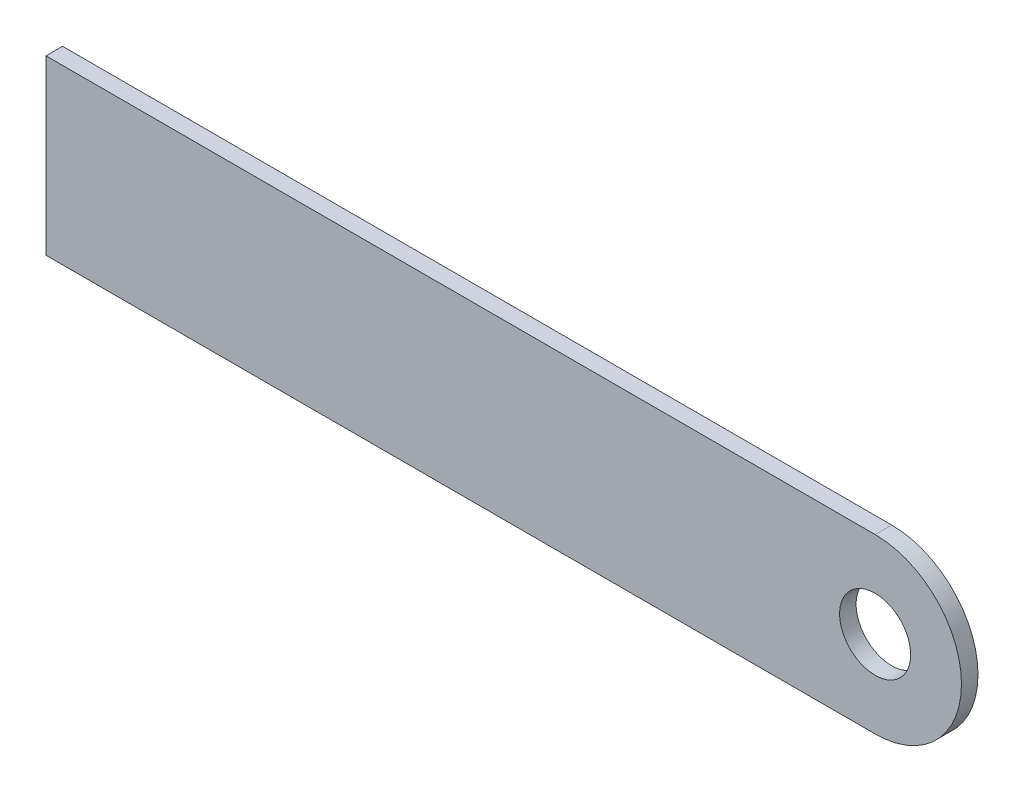
ISO-10303-21;
HEADER;
FILE_DESCRIPTION(('STEP AP214'),'2;1');
FILE_NAME('part.step','',(''),(''),'','','');
FILE_SCHEMA(('AUTOMOTIVE_DESIGN { 1 0 10303 214 1 1 1 1 }'));
ENDSEC;
DATA;
#1=APPLICATION_CONTEXT('core data for automotive mechanical design processes');
#2=APPLICATION_PROTOCOL_DEFINITION('international standard','automotive_design',2000,#1);
#3=PRODUCT_CONTEXT('',#1,'mechanical');
#4=PRODUCT('Part','Part','',(#3));
#5=PRODUCT_RELATED_PRODUCT_CATEGORY('part','',(#4));
#6=PRODUCT_DEFINITION_FORMATION('','',#4);
#7=PRODUCT_DEFINITION_CONTEXT('part definition',#1,'design');
#8=PRODUCT_DEFINITION('design','',#6,#7);
#9=PRODUCT_DEFINITION_SHAPE('','',#8);
#10=(LENGTH_UNIT() NAMED_UNIT(*) SI_UNIT(.MILLI.,.METRE.));
#11=(NAMED_UNIT(*) PLANE_ANGLE_UNIT() SI_UNIT($,.RADIAN.));
#12=(NAMED_UNIT(*) SI_UNIT($,.STERADIAN.) SOLID_ANGLE_UNIT());
#13=UNCERTAINTY_MEASURE_WITH_UNIT(LENGTH_MEASURE(1.E-05),#10,'distance_accuracy_value','');
#14=(GEOMETRIC_REPRESENTATION_CONTEXT(3) GLOBAL_UNCERTAINTY_ASSIGNED_CONTEXT((#13)) GLOBAL_UNIT_ASSIGNED_CONTEXT((#10,
#11,#12)) REPRESENTATION_CONTEXT('',''));
#15=CARTESIAN_POINT('',(0.,0.,0.));
#16=DIRECTION('',(0.,0.,1.));
#17=DIRECTION('',(1.,0.,0.));
#18=AXIS2_PLACEMENT_3D('',#15,#16,#17);
#19=CARTESIAN_POINT('',(0.,0.,-1.51892));
#20=DIRECTION('',(-1.,0.,0.));
#21=DIRECTION('',(0.,0.,1.));
#22=AXIS2_PLACEMENT_3D('',#19,#20,#21);
#23=PLANE('',#22);
#24=DIRECTION('',(0.,-1.,0.));
#25=VECTOR('',#24,1.);
#26=CARTESIAN_POINT('',(0.,0.,0.));
#27=LINE('',#26,#25);
#28=CARTESIAN_POINT('',(0.,15.875,0.));
#29=VERTEX_POINT('',#28);
#30=CARTESIAN_POINT('',(0.,0.,0.));
#31=VERTEX_POINT('',#30);
#32=EDGE_CURVE('E108',#29,#31,#27,.T.);
#33=ORIENTED_EDGE('',*,*,#32,.F.);
#34=DIRECTION('',(0.,0.,1.));
#35=VECTOR('',#34,1.);
#36=CARTESIAN_POINT('',(0.,15.875,-1.51892));
#37=LINE('',#36,#35);
#38=CARTESIAN_POINT('',(0.,15.875,-1.51892));
#39=VERTEX_POINT('',#38);
#40=EDGE_CURVE('E11',#39,#29,#37,.T.);
#41=ORIENTED_EDGE('',*,*,#40,.F.);
#42=DIRECTION('',(0.,-1.,0.));
#43=VECTOR('',#42,1.);
#44=CARTESIAN_POINT('',(0.,0.,-1.51892));
#45=LINE('',#44,#43);
#46=CARTESIAN_POINT('',(0.,0.,-1.51892));
#47=VERTEX_POINT('',#46);
#48=EDGE_CURVE('E101',#39,#47,#45,.T.);
#49=ORIENTED_EDGE('',*,*,#48,.T.);
#50=DIRECTION('',(0.,0.,1.));
#51=VECTOR('',#50,1.);
#52=CARTESIAN_POINT('',(0.,0.,-1.51892));
#53=LINE('',#52,#51);
#54=EDGE_CURVE('E46',#47,#31,#53,.T.);
#55=ORIENTED_EDGE('',*,*,#54,.T.);
#56=EDGE_LOOP('',(#33,#41,#49,#55));
#57=FACE_BOUND('',#56,.T.);
#58=ADVANCED_FACE('F43',(#57),#23,.T.);
#59=CARTESIAN_POINT('',(0.,15.875,-1.51892));
#60=DIRECTION('',(0.,1.,0.));
#61=DIRECTION('',(0.,0.,1.));
#62=AXIS2_PLACEMENT_3D('',#59,#60,#61);
#63=PLANE('',#62);
#64=DIRECTION('',(-1.,0.,0.));
#65=VECTOR('',#64,1.);
#66=CARTESIAN_POINT('',(0.,15.875,0.));
#67=LINE('',#66,#65);
#68=CARTESIAN_POINT('',(76.2,15.875,0.));
#69=VERTEX_POINT('',#68);
#70=EDGE_CURVE('E103',#69,#29,#67,.T.);
#71=ORIENTED_EDGE('',*,*,#70,.F.);
#72=DIRECTION('',(0.,0.,1.));
#73=VECTOR('',#72,1.);
#74=CARTESIAN_POINT('',(76.2,15.875,-1.51892));
#75=LINE('',#74,#73);
#76=CARTESIAN_POINT('',(76.2,15.875,-1.51892));
#77=VERTEX_POINT('',#76);
#78=EDGE_CURVE('E52',#77,#69,#75,.T.);
#79=ORIENTED_EDGE('',*,*,#78,.F.);
#80=DIRECTION('',(-1.,0.,0.));
#81=VECTOR('',#80,1.);
#82=CARTESIAN_POINT('',(0.,15.875,-1.51892));
#83=LINE('',#82,#81);
#84=EDGE_CURVE('E98',#77,#39,#83,.T.);
#85=ORIENTED_EDGE('',*,*,#84,.T.);
#86=ORIENTED_EDGE('',*,*,#40,.T.);
#87=EDGE_LOOP('',(#71,#79,#85,#86));
#88=FACE_BOUND('',#87,.T.);
#89=ADVANCED_FACE('F119',(#88),#63,.T.);
#90=CARTESIAN_POINT('',(76.2,7.9375,-1.51892));
#91=DIRECTION('',(0.,0.,1.));
#92=DIRECTION('',(1.,0.,0.));
#93=AXIS2_PLACEMENT_3D('',#90,#91,#92);
#94=CYLINDRICAL_SURFACE('',#93,7.9375);
#95=CARTESIAN_POINT('',(76.2,7.9375,0.));
#96=DIRECTION('',(0.,0.,1.));
#97=DIRECTION('',(-1.,0.,0.));
#98=AXIS2_PLACEMENT_3D('',#95,#96,#97);
#99=CIRCLE('',#98,7.9375);
#100=CARTESIAN_POINT('',(76.2,0.,0.));
#101=VERTEX_POINT('',#100);
#102=EDGE_CURVE('E93',#101,#69,#99,.T.);
#103=ORIENTED_EDGE('',*,*,#102,.F.);
#104=DIRECTION('',(0.,0.,1.));
#105=VECTOR('',#104,1.);
#106=CARTESIAN_POINT('',(76.2,0.,-1.51892));
#107=LINE('',#106,#105);
#108=CARTESIAN_POINT('',(76.2,0.,-1.51892));
#109=VERTEX_POINT('',#108);
#110=EDGE_CURVE('E88',#109,#101,#107,.T.);
#111=ORIENTED_EDGE('',*,*,#110,.F.);
#112=CARTESIAN_POINT('',(76.2,7.9375,-1.51892));
#113=DIRECTION('',(0.,0.,1.));
#114=DIRECTION('',(-1.,0.,0.));
#115=AXIS2_PLACEMENT_3D('',#112,#113,#114);
#116=CIRCLE('',#115,7.9375);
#117=EDGE_CURVE('E91',#109,#77,#116,.T.);
#118=ORIENTED_EDGE('',*,*,#117,.T.);
#119=ORIENTED_EDGE('',*,*,#78,.T.);
#120=EDGE_LOOP('',(#103,#111,#118,#119));
#121=FACE_BOUND('',#120,.T.);
#122=ADVANCED_FACE('F90',(#121),#94,.T.);
#123=CARTESIAN_POINT('',(0.,0.,-1.51892));
#124=DIRECTION('',(0.,-1.,0.));
#125=DIRECTION('',(0.,0.,-1.));
#126=AXIS2_PLACEMENT_3D('',#123,#124,#125);
#127=PLANE('',#126);
#128=DIRECTION('',(1.,0.,0.));
#129=VECTOR('',#128,1.);
#130=CARTESIAN_POINT('',(0.,0.,0.));
#131=LINE('',#130,#129);
#132=EDGE_CURVE('E111',#31,#101,#131,.T.);
#133=ORIENTED_EDGE('',*,*,#132,.F.);
#134=ORIENTED_EDGE('',*,*,#54,.F.);
#135=DIRECTION('',(1.,0.,0.));
#136=VECTOR('',#135,1.);
#137=CARTESIAN_POINT('',(0.,0.,-1.51892));
#138=LINE('',#137,#136);
#139=EDGE_CURVE('E97',#47,#109,#138,.T.);
#140=ORIENTED_EDGE('',*,*,#139,.T.);
#141=ORIENTED_EDGE('',*,*,#110,.T.);
#142=EDGE_LOOP('',(#133,#134,#140,#141));
#143=FACE_BOUND('',#142,.T.);
#144=ADVANCED_FACE('F100',(#143),#127,.T.);
#145=CARTESIAN_POINT('',(76.2,7.9375,-1.51892));
#146=DIRECTION('',(0.,0.,-1.));
#147=DIRECTION('',(-1.,0.,0.));
#148=AXIS2_PLACEMENT_3D('',#145,#146,#147);
#149=PLANE('',#148);
#150=CARTESIAN_POINT('',(76.2,7.9375,-1.51892));
#151=DIRECTION('',(0.,0.,1.));
#152=DIRECTION('',(1.,0.,0.));
#153=AXIS2_PLACEMENT_3D('',#150,#151,#152);
#154=CIRCLE('',#153,3.26389999999999);
#155=CARTESIAN_POINT('',(79.4639,7.9375,-1.51892));
#156=VERTEX_POINT('',#155);
#157=EDGE_CURVE('E112',#156,#156,#154,.T.);
#158=ORIENTED_EDGE('',*,*,#157,.T.);
#159=EDGE_LOOP('',(#158));
#160=FACE_BOUND('',#159,.T.);
#161=ORIENTED_EDGE('',*,*,#48,.F.);
#162=ORIENTED_EDGE('',*,*,#84,.F.);
#163=ORIENTED_EDGE('',*,*,#117,.F.);
#164=ORIENTED_EDGE('',*,*,#139,.F.);
#165=EDGE_LOOP('',(#161,#162,#163,#164));
#166=FACE_BOUND('',#165,.T.);
#167=ADVANCED_FACE('F96',(#160,#166),#149,.T.);
#168=CARTESIAN_POINT('',(76.2,7.9375,0.));
#169=DIRECTION('',(0.,0.,-1.));
#170=DIRECTION('',(-1.,0.,0.));
#171=AXIS2_PLACEMENT_3D('',#168,#169,#170);
#172=PLANE('',#171);
#173=CARTESIAN_POINT('',(76.2,7.9375,0.));
#174=DIRECTION('',(0.,0.,1.));
#175=DIRECTION('',(1.,0.,0.));
#176=AXIS2_PLACEMENT_3D('',#173,#174,#175);
#177=CIRCLE('',#176,3.26389999999999);
#178=CARTESIAN_POINT('',(79.4639,7.9375,0.));
#179=VERTEX_POINT('',#178);
#180=EDGE_CURVE('E149',#179,#179,#177,.T.);
#181=ORIENTED_EDGE('',*,*,#180,.F.);
#182=EDGE_LOOP('',(#181));
#183=FACE_BOUND('',#182,.T.);
#184=ORIENTED_EDGE('',*,*,#32,.T.);
#185=ORIENTED_EDGE('',*,*,#132,.T.);
#186=ORIENTED_EDGE('',*,*,#102,.T.);
#187=ORIENTED_EDGE('',*,*,#70,.T.);
#188=EDGE_LOOP('',(#184,#185,#186,#187));
#189=FACE_BOUND('',#188,.T.);
#190=ADVANCED_FACE('F118',(#183,#189),#172,.F.);
#191=CARTESIAN_POINT('',(76.2,7.9375,-1.51892));
#192=DIRECTION('',(0.,0.,1.));
#193=DIRECTION('',(1.,0.,0.));
#194=AXIS2_PLACEMENT_3D('',#191,#192,#193);
#195=CYLINDRICAL_SURFACE('',#194,3.26389999999999);
#196=ORIENTED_EDGE('',*,*,#157,.F.);
#197=EDGE_LOOP('',(#196));
#198=FACE_BOUND('',#197,.T.);
#199=ORIENTED_EDGE('',*,*,#180,.T.);
#200=EDGE_LOOP('',(#199));
#201=FACE_BOUND('',#200,.T.);
#202=ADVANCED_FACE('F137',(#198,#201),#195,.F.);
#203=CLOSED_SHELL('',(#58,#89,#122,#144,#167,#190,#202));
#204=MANIFOLD_SOLID_BREP('B2',#203);
#205=ADVANCED_BREP_SHAPE_REPRESENTATION('',(#18,#204),#14);
#206=SHAPE_DEFINITION_REPRESENTATION(#9,#205);
ENDSEC;
END-ISO-10303-21;
